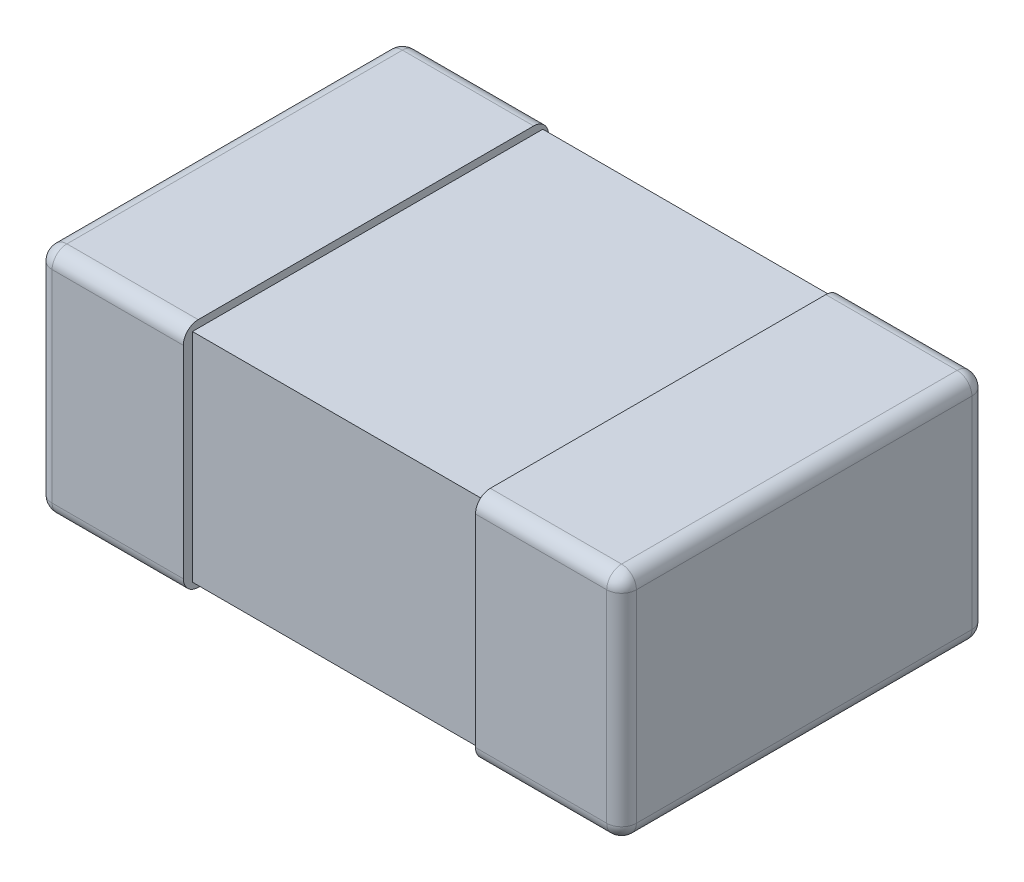
ISO-10303-21;
HEADER;
FILE_DESCRIPTION(('STEP AP214'),'2;1');
FILE_NAME('part.step','',(''),(''),'','','');
FILE_SCHEMA(('AUTOMOTIVE_DESIGN { 1 0 10303 214 1 1 1 1 }'));
ENDSEC;
DATA;
#1=APPLICATION_CONTEXT('core data for automotive mechanical design processes');
#2=APPLICATION_PROTOCOL_DEFINITION('international standard','automotive_design',2000,#1);
#3=PRODUCT_CONTEXT('',#1,'mechanical');
#4=PRODUCT('Part','Part','',(#3));
#5=PRODUCT_RELATED_PRODUCT_CATEGORY('part','',(#4));
#6=PRODUCT_DEFINITION_FORMATION('','',#4);
#7=PRODUCT_DEFINITION_CONTEXT('part definition',#1,'design');
#8=PRODUCT_DEFINITION('design','',#6,#7);
#9=PRODUCT_DEFINITION_SHAPE('','',#8);
#10=(LENGTH_UNIT() NAMED_UNIT(*) SI_UNIT(.MILLI.,.METRE.));
#11=(NAMED_UNIT(*) PLANE_ANGLE_UNIT() SI_UNIT($,.RADIAN.));
#12=(NAMED_UNIT(*) SI_UNIT($,.STERADIAN.) SOLID_ANGLE_UNIT());
#13=UNCERTAINTY_MEASURE_WITH_UNIT(LENGTH_MEASURE(1.E-05),#10,'distance_accuracy_value','');
#14=(GEOMETRIC_REPRESENTATION_CONTEXT(3) GLOBAL_UNCERTAINTY_ASSIGNED_CONTEXT((#13)) GLOBAL_UNIT_ASSIGNED_CONTEXT((#10,
#11,#12)) REPRESENTATION_CONTEXT('',''));
#15=CARTESIAN_POINT('',(0.,0.,0.));
#16=DIRECTION('',(0.,0.,1.));
#17=DIRECTION('',(1.,0.,0.));
#18=AXIS2_PLACEMENT_3D('',#15,#16,#17);
#19=CARTESIAN_POINT('',(-0.875,0.74295,-1.1992));
#20=DIRECTION('',(-1.,0.,0.));
#21=DIRECTION('',(0.,0.707106781186548,-0.707106781186548));
#22=AXIS2_PLACEMENT_3D('',#19,#20,#21);
#23=CYLINDRICAL_SURFACE('',#22,0.0508);
#24=CARTESIAN_POINT('',(-1.5,0.74295,-1.1992));
#25=DIRECTION('',(-1.,0.,0.));
#26=DIRECTION('',(0.,0.707106781186548,-0.707106781186548));
#27=AXIS2_PLACEMENT_3D('',#24,#25,#26);
#28=CIRCLE('',#27,0.0508);
#29=CARTESIAN_POINT('',(-1.5,0.79375,-1.1992));
#30=VERTEX_POINT('',#29);
#31=CARTESIAN_POINT('',(-1.5,0.74295,-1.25));
#32=VERTEX_POINT('',#31);
#33=EDGE_CURVE('E366',#30,#32,#28,.T.);
#34=ORIENTED_EDGE('',*,*,#33,.T.);
#35=DIRECTION('',(-1.,0.,0.));
#36=VECTOR('',#35,1.);
#37=CARTESIAN_POINT('',(-0.875,0.74295,-1.25));
#38=LINE('',#37,#36);
#39=CARTESIAN_POINT('',(-1.9492,0.74295,-1.25));
#40=VERTEX_POINT('',#39);
#41=EDGE_CURVE('E20',#32,#40,#38,.T.);
#42=ORIENTED_EDGE('',*,*,#41,.T.);
#43=CARTESIAN_POINT('',(-1.9492,0.74295,-1.1992));
#44=DIRECTION('',(1.,0.,0.));
#45=DIRECTION('',(0.,0.,-1.));
#46=AXIS2_PLACEMENT_3D('',#43,#44,#45);
#47=CIRCLE('',#46,0.0508);
#48=CARTESIAN_POINT('',(-1.9492,0.79375,-1.1992));
#49=VERTEX_POINT('',#48);
#50=EDGE_CURVE('E269',#40,#49,#47,.T.);
#51=ORIENTED_EDGE('',*,*,#50,.T.);
#52=DIRECTION('',(1.,0.,0.));
#53=VECTOR('',#52,1.);
#54=CARTESIAN_POINT('',(-0.875,0.79375,-1.1992));
#55=LINE('',#54,#53);
#56=EDGE_CURVE('E275',#49,#30,#55,.T.);
#57=ORIENTED_EDGE('',*,*,#56,.T.);
#58=EDGE_LOOP('',(#34,#42,#51,#57));
#59=FACE_BOUND('',#58,.T.);
#60=ADVANCED_FACE('F16',(#59),#23,.T.);
#61=CARTESIAN_POINT('',(-1.9492,0.,-1.1992));
#62=DIRECTION('',(0.,1.,0.));
#63=DIRECTION('',(-0.707106781186549,0.,-0.707106781186546));
#64=AXIS2_PLACEMENT_3D('',#61,#62,#63);
#65=CYLINDRICAL_SURFACE('',#64,0.0508);
#66=CARTESIAN_POINT('',(-1.9492,0.0508,-1.1992));
#67=DIRECTION('',(0.,1.,0.));
#68=DIRECTION('',(0.,0.,-1.));
#69=AXIS2_PLACEMENT_3D('',#66,#67,#68);
#70=CIRCLE('',#69,0.0508);
#71=CARTESIAN_POINT('',(-1.9492,0.0508,-1.25));
#72=VERTEX_POINT('',#71);
#73=CARTESIAN_POINT('',(-2.,0.0508,-1.1992));
#74=VERTEX_POINT('',#73);
#75=EDGE_CURVE('E11',#72,#74,#70,.T.);
#76=ORIENTED_EDGE('',*,*,#75,.T.);
#77=DIRECTION('',(0.,1.,0.));
#78=VECTOR('',#77,1.);
#79=CARTESIAN_POINT('',(-2.,0.,-1.1992));
#80=LINE('',#79,#78);
#81=CARTESIAN_POINT('',(-2.,0.74295,-1.1992));
#82=VERTEX_POINT('',#81);
#83=EDGE_CURVE('E384',#74,#82,#80,.T.);
#84=ORIENTED_EDGE('',*,*,#83,.T.);
#85=CARTESIAN_POINT('',(-1.9492,0.74295,-1.1992));
#86=DIRECTION('',(0.,-1.,0.));
#87=DIRECTION('',(-1.,0.,0.));
#88=AXIS2_PLACEMENT_3D('',#85,#86,#87);
#89=CIRCLE('',#88,0.0508);
#90=EDGE_CURVE('E41',#82,#40,#89,.T.);
#91=ORIENTED_EDGE('',*,*,#90,.T.);
#92=DIRECTION('',(0.,-1.,0.));
#93=VECTOR('',#92,1.);
#94=CARTESIAN_POINT('',(-1.9492,0.,-1.25));
#95=LINE('',#94,#93);
#96=EDGE_CURVE('E280',#40,#72,#95,.T.);
#97=ORIENTED_EDGE('',*,*,#96,.T.);
#98=EDGE_LOOP('',(#76,#84,#91,#97));
#99=FACE_BOUND('',#98,.T.);
#100=ADVANCED_FACE('F623',(#99),#65,.T.);
#101=CARTESIAN_POINT('',(-0.875,0.0508,-1.1992));
#102=DIRECTION('',(-1.,0.,0.));
#103=DIRECTION('',(0.,-0.707106781186547,-0.707106781186548));
#104=AXIS2_PLACEMENT_3D('',#101,#102,#103);
#105=CYLINDRICAL_SURFACE('',#104,0.0508);
#106=CARTESIAN_POINT('',(-1.5,0.0508,-1.1992));
#107=DIRECTION('',(-1.,0.,0.));
#108=DIRECTION('',(0.,-0.707106781186547,-0.707106781186548));
#109=AXIS2_PLACEMENT_3D('',#106,#107,#108);
#110=CIRCLE('',#109,0.0508);
#111=CARTESIAN_POINT('',(-1.5,0.0508,-1.25));
#112=VERTEX_POINT('',#111);
#113=CARTESIAN_POINT('',(-1.5,0.,-1.1992));
#114=VERTEX_POINT('',#113);
#115=EDGE_CURVE('E293',#112,#114,#110,.T.);
#116=ORIENTED_EDGE('',*,*,#115,.T.);
#117=DIRECTION('',(-1.,0.,0.));
#118=VECTOR('',#117,1.);
#119=CARTESIAN_POINT('',(-0.875,0.,-1.1992));
#120=LINE('',#119,#118);
#121=CARTESIAN_POINT('',(-1.9492,0.,-1.1992));
#122=VERTEX_POINT('',#121);
#123=EDGE_CURVE('E106',#114,#122,#120,.T.);
#124=ORIENTED_EDGE('',*,*,#123,.T.);
#125=CARTESIAN_POINT('',(-1.9492,0.0508,-1.1992));
#126=DIRECTION('',(1.,0.,0.));
#127=DIRECTION('',(0.,-1.,0.));
#128=AXIS2_PLACEMENT_3D('',#125,#126,#127);
#129=CIRCLE('',#128,0.0508);
#130=EDGE_CURVE('E27',#122,#72,#129,.T.);
#131=ORIENTED_EDGE('',*,*,#130,.T.);
#132=DIRECTION('',(1.,0.,0.));
#133=VECTOR('',#132,1.);
#134=CARTESIAN_POINT('',(-0.875,0.0508,-1.25));
#135=LINE('',#134,#133);
#136=EDGE_CURVE('E285',#72,#112,#135,.T.);
#137=ORIENTED_EDGE('',*,*,#136,.T.);
#138=EDGE_LOOP('',(#116,#124,#131,#137));
#139=FACE_BOUND('',#138,.T.);
#140=ADVANCED_FACE('F628',(#139),#105,.T.);
#141=CARTESIAN_POINT('',(-1.9492,0.0508,-1.1992));
#142=DIRECTION('',(0.408248290463862,-0.816496580927727,0.408248290463862));
#143=DIRECTION('',(-0.577350269189626,-0.577350269189624,-0.577350269189626));
#144=AXIS2_PLACEMENT_3D('',#141,#142,#143);
#145=SPHERICAL_SURFACE('',#144,0.0508);
#146=ORIENTED_EDGE('',*,*,#130,.F.);
#147=CARTESIAN_POINT('',(-1.9492,0.0508,-1.1992));
#148=DIRECTION('',(0.,0.,-1.));
#149=DIRECTION('',(-0.707106781186549,-0.707106781186546,0.));
#150=AXIS2_PLACEMENT_3D('',#147,#148,#149);
#151=CIRCLE('',#150,0.0508);
#152=EDGE_CURVE('E317',#122,#74,#151,.T.);
#153=ORIENTED_EDGE('',*,*,#152,.T.);
#154=ORIENTED_EDGE('',*,*,#75,.F.);
#155=EDGE_LOOP('',(#146,#153,#154));
#156=FACE_BOUND('',#155,.T.);
#157=ADVANCED_FACE('F717',(#156),#145,.T.);
#158=CARTESIAN_POINT('',(-1.9492,0.74295,-1.1992));
#159=DIRECTION('',(-0.408248290463861,-0.816496580927726,-0.408248290463865));
#160=DIRECTION('',(-0.577350269189626,0.577350269189626,-0.577350269189626));
#161=AXIS2_PLACEMENT_3D('',#158,#159,#160);
#162=SPHERICAL_SURFACE('',#161,0.0508);
#163=ORIENTED_EDGE('',*,*,#90,.F.);
#164=CARTESIAN_POINT('',(-1.9492,0.74295,-1.1992));
#165=DIRECTION('',(0.,0.,-1.));
#166=DIRECTION('',(-0.707106781186549,0.707106781186546,0.));
#167=AXIS2_PLACEMENT_3D('',#164,#165,#166);
#168=CIRCLE('',#167,0.0508);
#169=EDGE_CURVE('E355',#82,#49,#168,.T.);
#170=ORIENTED_EDGE('',*,*,#169,.T.);
#171=ORIENTED_EDGE('',*,*,#50,.F.);
#172=EDGE_LOOP('',(#163,#170,#171));
#173=FACE_BOUND('',#172,.T.);
#174=ADVANCED_FACE('F687',(#173),#162,.T.);
#175=CARTESIAN_POINT('',(-1.9492,0.74295,-0.9375));
#176=DIRECTION('',(0.,0.,1.));
#177=DIRECTION('',(-0.707106781186549,0.707106781186546,0.));
#178=AXIS2_PLACEMENT_3D('',#175,#176,#177);
#179=CYLINDRICAL_SURFACE('',#178,0.0508);
#180=ORIENTED_EDGE('',*,*,#169,.F.);
#181=DIRECTION('',(0.,0.,1.));
#182=VECTOR('',#181,1.);
#183=CARTESIAN_POINT('',(-2.,0.74295,-0.9375));
#184=LINE('',#183,#182);
#185=CARTESIAN_POINT('',(-2.,0.74295,-0.0508));
#186=VERTEX_POINT('',#185);
#187=EDGE_CURVE('E388',#82,#186,#184,.T.);
#188=ORIENTED_EDGE('',*,*,#187,.T.);
#189=CARTESIAN_POINT('',(-1.9492,0.74295,-0.0508));
#190=DIRECTION('',(0.,0.,-1.));
#191=DIRECTION('',(-1.,0.,0.));
#192=AXIS2_PLACEMENT_3D('',#189,#190,#191);
#193=CIRCLE('',#192,0.0508);
#194=CARTESIAN_POINT('',(-1.9492,0.79375,-0.0508));
#195=VERTEX_POINT('',#194);
#196=EDGE_CURVE('E363',#186,#195,#193,.T.);
#197=ORIENTED_EDGE('',*,*,#196,.T.);
#198=DIRECTION('',(0.,0.,-1.));
#199=VECTOR('',#198,1.);
#200=CARTESIAN_POINT('',(-1.9492,0.79375,-0.9375));
#201=LINE('',#200,#199);
#202=EDGE_CURVE('E279',#195,#49,#201,.T.);
#203=ORIENTED_EDGE('',*,*,#202,.T.);
#204=EDGE_LOOP('',(#180,#188,#197,#203));
#205=FACE_BOUND('',#204,.T.);
#206=ADVANCED_FACE('F685',(#205),#179,.T.);
#207=CARTESIAN_POINT('',(-2.,0.,-1.25));
#208=DIRECTION('',(-1.,0.,0.));
#209=DIRECTION('',(0.,0.,1.));
#210=AXIS2_PLACEMENT_3D('',#207,#208,#209);
#211=PLANE('',#210);
#212=ORIENTED_EDGE('',*,*,#83,.F.);
#213=DIRECTION('',(0.,0.,-1.));
#214=VECTOR('',#213,1.);
#215=CARTESIAN_POINT('',(-2.,0.0508,-0.9375));
#216=LINE('',#215,#214);
#217=CARTESIAN_POINT('',(-2.,0.0508,-0.0508));
#218=VERTEX_POINT('',#217);
#219=EDGE_CURVE('E389',#218,#74,#216,.T.);
#220=ORIENTED_EDGE('',*,*,#219,.F.);
#221=DIRECTION('',(0.,-1.,0.));
#222=VECTOR('',#221,1.);
#223=CARTESIAN_POINT('',(-2.,0.,-0.0508));
#224=LINE('',#223,#222);
#225=EDGE_CURVE('E318',#186,#218,#224,.T.);
#226=ORIENTED_EDGE('',*,*,#225,.F.);
#227=ORIENTED_EDGE('',*,*,#187,.F.);
#228=EDGE_LOOP('',(#212,#220,#226,#227));
#229=FACE_BOUND('',#228,.T.);
#230=ADVANCED_FACE('F665',(#229),#211,.T.);
#231=CARTESIAN_POINT('',(-1.9492,0.0508,-0.9375));
#232=DIRECTION('',(0.,0.,1.));
#233=DIRECTION('',(-0.70710678118655,-0.707106781186546,0.));
#234=AXIS2_PLACEMENT_3D('',#231,#232,#233);
#235=CYLINDRICAL_SURFACE('',#234,0.0508);
#236=ORIENTED_EDGE('',*,*,#152,.F.);
#237=DIRECTION('',(0.,0.,1.));
#238=VECTOR('',#237,1.);
#239=CARTESIAN_POINT('',(-1.9492,0.,-0.9375));
#240=LINE('',#239,#238);
#241=CARTESIAN_POINT('',(-1.9492,0.,-0.0508));
#242=VERTEX_POINT('',#241);
#243=EDGE_CURVE('E314',#122,#242,#240,.T.);
#244=ORIENTED_EDGE('',*,*,#243,.T.);
#245=CARTESIAN_POINT('',(-1.9492,0.0508,-0.0508));
#246=DIRECTION('',(0.,0.,-1.));
#247=DIRECTION('',(0.,-1.,0.));
#248=AXIS2_PLACEMENT_3D('',#245,#246,#247);
#249=CIRCLE('',#248,0.0508);
#250=EDGE_CURVE('E338',#242,#218,#249,.T.);
#251=ORIENTED_EDGE('',*,*,#250,.T.);
#252=ORIENTED_EDGE('',*,*,#219,.T.);
#253=EDGE_LOOP('',(#236,#244,#251,#252));
#254=FACE_BOUND('',#253,.T.);
#255=ADVANCED_FACE('F661',(#254),#235,.T.);
#256=CARTESIAN_POINT('',(-0.25,0.,-0.625));
#257=DIRECTION('',(0.,1.,0.));
#258=DIRECTION('',(1.,0.,0.));
#259=AXIS2_PLACEMENT_3D('',#256,#257,#258);
#260=PLANE('',#259);
#261=ORIENTED_EDGE('',*,*,#123,.F.);
#262=DIRECTION('',(0.,0.,-1.));
#263=VECTOR('',#262,1.);
#264=CARTESIAN_POINT('',(-1.5,0.,0.));
#265=LINE('',#264,#263);
#266=CARTESIAN_POINT('',(-1.5,0.,-0.0508));
#267=VERTEX_POINT('',#266);
#268=EDGE_CURVE('E289',#267,#114,#265,.T.);
#269=ORIENTED_EDGE('',*,*,#268,.F.);
#270=DIRECTION('',(1.,0.,0.));
#271=VECTOR('',#270,1.);
#272=CARTESIAN_POINT('',(-1.125,0.,-0.0508));
#273=LINE('',#272,#271);
#274=EDGE_CURVE('E409',#242,#267,#273,.T.);
#275=ORIENTED_EDGE('',*,*,#274,.F.);
#276=ORIENTED_EDGE('',*,*,#243,.F.);
#277=EDGE_LOOP('',(#261,#269,#275,#276));
#278=FACE_BOUND('',#277,.T.);
#279=ADVANCED_FACE('F664',(#278),#260,.F.);
#280=CARTESIAN_POINT('',(-1.125,0.0508,-0.0508));
#281=DIRECTION('',(1.,0.,0.));
#282=DIRECTION('',(0.,-0.707106781186548,0.707106781186547));
#283=AXIS2_PLACEMENT_3D('',#280,#281,#282);
#284=CYLINDRICAL_SURFACE('',#283,0.0508);
#285=CARTESIAN_POINT('',(-1.5,0.0508,-0.0508));
#286=DIRECTION('',(-1.,0.,0.));
#287=DIRECTION('',(0.,-0.707106781186548,0.707106781186547));
#288=AXIS2_PLACEMENT_3D('',#285,#286,#287);
#289=CIRCLE('',#288,0.0508);
#290=CARTESIAN_POINT('',(-1.5,0.0508,0.));
#291=VERTEX_POINT('',#290);
#292=EDGE_CURVE('E294',#267,#291,#289,.T.);
#293=ORIENTED_EDGE('',*,*,#292,.T.);
#294=DIRECTION('',(-1.,0.,0.));
#295=VECTOR('',#294,1.);
#296=CARTESIAN_POINT('',(-1.125,0.0508,0.));
#297=LINE('',#296,#295);
#298=CARTESIAN_POINT('',(-1.9492,0.0508,0.));
#299=VERTEX_POINT('',#298);
#300=EDGE_CURVE('E192',#291,#299,#297,.T.);
#301=ORIENTED_EDGE('',*,*,#300,.T.);
#302=CARTESIAN_POINT('',(-1.9492,0.0508,-0.0508));
#303=DIRECTION('',(1.,0.,0.));
#304=DIRECTION('',(0.,0.,1.));
#305=AXIS2_PLACEMENT_3D('',#302,#303,#304);
#306=CIRCLE('',#305,0.0508);
#307=EDGE_CURVE('E91',#299,#242,#306,.T.);
#308=ORIENTED_EDGE('',*,*,#307,.T.);
#309=ORIENTED_EDGE('',*,*,#274,.T.);
#310=EDGE_LOOP('',(#293,#301,#308,#309));
#311=FACE_BOUND('',#310,.T.);
#312=ADVANCED_FACE('F673',(#311),#284,.T.);
#313=CARTESIAN_POINT('',(-1.9492,0.0508,-0.0508));
#314=DIRECTION('',(0.408248290463861,-0.816496580927725,-0.408248290463867));
#315=DIRECTION('',(-0.57735026918962,-0.577350269189628,0.57735026918963));
#316=AXIS2_PLACEMENT_3D('',#313,#314,#315);
#317=SPHERICAL_SURFACE('',#316,0.0508);
#318=ORIENTED_EDGE('',*,*,#307,.F.);
#319=CARTESIAN_POINT('',(-1.9492,0.0508,-0.0508));
#320=DIRECTION('',(0.,-1.,0.));
#321=DIRECTION('',(-0.707106781186545,0.,0.707106781186551));
#322=AXIS2_PLACEMENT_3D('',#319,#320,#321);
#323=CIRCLE('',#322,0.0508);
#324=EDGE_CURVE('E322',#299,#218,#323,.T.);
#325=ORIENTED_EDGE('',*,*,#324,.T.);
#326=ORIENTED_EDGE('',*,*,#250,.F.);
#327=EDGE_LOOP('',(#318,#325,#326));
#328=FACE_BOUND('',#327,.T.);
#329=ADVANCED_FACE('F18',(#328),#317,.T.);
#330=CARTESIAN_POINT('',(-1.9492,0.,-0.0508));
#331=DIRECTION('',(0.,1.,0.));
#332=DIRECTION('',(-0.707106781186546,0.,0.707106781186549));
#333=AXIS2_PLACEMENT_3D('',#330,#331,#332);
#334=CYLINDRICAL_SURFACE('',#333,0.0508);
#335=ORIENTED_EDGE('',*,*,#324,.F.);
#336=DIRECTION('',(0.,1.,0.));
#337=VECTOR('',#336,1.);
#338=CARTESIAN_POINT('',(-1.9492,0.,0.));
#339=LINE('',#338,#337);
#340=CARTESIAN_POINT('',(-1.9492,0.74295,0.));
#341=VERTEX_POINT('',#340);
#342=EDGE_CURVE('E333',#299,#341,#339,.T.);
#343=ORIENTED_EDGE('',*,*,#342,.T.);
#344=CARTESIAN_POINT('',(-1.9492,0.74295,-0.0508));
#345=DIRECTION('',(0.,1.,0.));
#346=DIRECTION('',(-0.707106781186545,0.,0.707106781186551));
#347=AXIS2_PLACEMENT_3D('',#344,#345,#346);
#348=CIRCLE('',#347,0.0508);
#349=EDGE_CURVE('E358',#186,#341,#348,.T.);
#350=ORIENTED_EDGE('',*,*,#349,.F.);
#351=ORIENTED_EDGE('',*,*,#225,.T.);
#352=EDGE_LOOP('',(#335,#343,#350,#351));
#353=FACE_BOUND('',#352,.T.);
#354=ADVANCED_FACE('F657',(#353),#334,.T.);
#355=CARTESIAN_POINT('',(-2.,0.,0.));
#356=DIRECTION('',(0.,0.,1.));
#357=DIRECTION('',(1.,0.,0.));
#358=AXIS2_PLACEMENT_3D('',#355,#356,#357);
#359=PLANE('',#358);
#360=ORIENTED_EDGE('',*,*,#300,.F.);
#361=DIRECTION('',(0.,1.,0.));
#362=VECTOR('',#361,1.);
#363=CARTESIAN_POINT('',(-1.5,0.,0.));
#364=LINE('',#363,#362);
#365=CARTESIAN_POINT('',(-1.5,0.74295,0.));
#366=VERTEX_POINT('',#365);
#367=EDGE_CURVE('E183',#291,#366,#364,.T.);
#368=ORIENTED_EDGE('',*,*,#367,.T.);
#369=DIRECTION('',(1.,0.,0.));
#370=VECTOR('',#369,1.);
#371=CARTESIAN_POINT('',(-1.125,0.74295,0.));
#372=LINE('',#371,#370);
#373=EDGE_CURVE('E453',#341,#366,#372,.T.);
#374=ORIENTED_EDGE('',*,*,#373,.F.);
#375=ORIENTED_EDGE('',*,*,#342,.F.);
#376=EDGE_LOOP('',(#360,#368,#374,#375));
#377=FACE_BOUND('',#376,.T.);
#378=ADVANCED_FACE('F655',(#377),#359,.T.);
#379=CARTESIAN_POINT('',(-1.5,0.,0.));
#380=DIRECTION('',(1.,0.,0.));
#381=DIRECTION('',(0.,1.,0.));
#382=AXIS2_PLACEMENT_3D('',#379,#380,#381);
#383=PLANE('',#382);
#384=ORIENTED_EDGE('',*,*,#33,.F.);
#385=DIRECTION('',(0.,0.,-1.));
#386=VECTOR('',#385,1.);
#387=CARTESIAN_POINT('',(-1.5,0.79375,0.));
#388=LINE('',#387,#386);
#389=CARTESIAN_POINT('',(-1.5,0.79375,-0.0508));
#390=VERTEX_POINT('',#389);
#391=EDGE_CURVE('E371',#390,#30,#388,.T.);
#392=ORIENTED_EDGE('',*,*,#391,.F.);
#393=CARTESIAN_POINT('',(-1.5,0.74295,-0.0508));
#394=DIRECTION('',(-1.,0.,0.));
#395=DIRECTION('',(0.,0.707106781186548,0.707106781186548));
#396=AXIS2_PLACEMENT_3D('',#393,#394,#395);
#397=CIRCLE('',#396,0.0508);
#398=EDGE_CURVE('E436',#366,#390,#397,.T.);
#399=ORIENTED_EDGE('',*,*,#398,.F.);
#400=ORIENTED_EDGE('',*,*,#367,.F.);
#401=ORIENTED_EDGE('',*,*,#292,.F.);
#402=ORIENTED_EDGE('',*,*,#268,.T.);
#403=ORIENTED_EDGE('',*,*,#115,.F.);
#404=DIRECTION('',(0.,1.,0.));
#405=VECTOR('',#404,1.);
#406=CARTESIAN_POINT('',(-1.5,0.,-1.25));
#407=LINE('',#406,#405);
#408=EDGE_CURVE('E327',#112,#32,#407,.T.);
#409=ORIENTED_EDGE('',*,*,#408,.T.);
#410=EDGE_LOOP('',(#384,#392,#399,#400,#401,#402,#403,#409));
#411=FACE_BOUND('',#410,.T.);
#412=DIRECTION('',(0.,0.,1.));
#413=VECTOR('',#412,1.);
#414=CARTESIAN_POINT('',(-1.5,0.0254,-0.0311176478090803));
#415=LINE('',#414,#413);
#416=CARTESIAN_POINT('',(-1.5,0.0254,-1.2303875922363));
#417=VERTEX_POINT('',#416);
#418=CARTESIAN_POINT('',(-1.5,0.0254,-0.0311176478090803));
#419=VERTEX_POINT('',#418);
#420=EDGE_CURVE('E310',#417,#419,#415,.T.);
#421=ORIENTED_EDGE('',*,*,#420,.T.);
#422=DIRECTION('',(0.,1.,0.));
#423=VECTOR('',#422,1.);
#424=CARTESIAN_POINT('',(-1.5,0.,-0.0311176478090803));
#425=LINE('',#424,#423);
#426=CARTESIAN_POINT('',(-1.5,0.76835,-0.0311176478090803));
#427=VERTEX_POINT('',#426);
#428=EDGE_CURVE('E257',#419,#427,#425,.T.);
#429=ORIENTED_EDGE('',*,*,#428,.T.);
#430=DIRECTION('',(0.,0.,-1.));
#431=VECTOR('',#430,1.);
#432=CARTESIAN_POINT('',(-1.5,0.76835,-1.2303875922363));
#433=LINE('',#432,#431);
#434=CARTESIAN_POINT('',(-1.5,0.76835,-1.2303875922363));
#435=VERTEX_POINT('',#434);
#436=EDGE_CURVE('E442',#427,#435,#433,.T.);
#437=ORIENTED_EDGE('',*,*,#436,.T.);
#438=DIRECTION('',(0.,-1.,0.));
#439=VECTOR('',#438,1.);
#440=CARTESIAN_POINT('',(-1.5,0.,-1.2303875922363));
#441=LINE('',#440,#439);
#442=EDGE_CURVE('E264',#435,#417,#441,.T.);
#443=ORIENTED_EDGE('',*,*,#442,.T.);
#444=EDGE_LOOP('',(#421,#429,#437,#443));
#445=FACE_BOUND('',#444,.T.);
#446=ADVANCED_FACE('F651',(#411,#445),#383,.T.);
#447=CARTESIAN_POINT('',(-1.125,0.74295,-0.0508));
#448=DIRECTION('',(1.,0.,0.));
#449=DIRECTION('',(0.,0.707106781186548,0.707106781186548));
#450=AXIS2_PLACEMENT_3D('',#447,#448,#449);
#451=CYLINDRICAL_SURFACE('',#450,0.0508);
#452=ORIENTED_EDGE('',*,*,#398,.T.);
#453=DIRECTION('',(-1.,0.,0.));
#454=VECTOR('',#453,1.);
#455=CARTESIAN_POINT('',(-1.125,0.79375,-0.0508));
#456=LINE('',#455,#454);
#457=EDGE_CURVE('E367',#390,#195,#456,.T.);
#458=ORIENTED_EDGE('',*,*,#457,.T.);
#459=CARTESIAN_POINT('',(-1.9492,0.74295,-0.0508));
#460=DIRECTION('',(1.,0.,0.));
#461=DIRECTION('',(0.,1.,0.));
#462=AXIS2_PLACEMENT_3D('',#459,#460,#461);
#463=CIRCLE('',#462,0.0508);
#464=EDGE_CURVE('E362',#195,#341,#463,.T.);
#465=ORIENTED_EDGE('',*,*,#464,.T.);
#466=ORIENTED_EDGE('',*,*,#373,.T.);
#467=EDGE_LOOP('',(#452,#458,#465,#466));
#468=FACE_BOUND('',#467,.T.);
#469=ADVANCED_FACE('F654',(#468),#451,.T.);
#470=CARTESIAN_POINT('',(-1.9492,0.74295,-0.0508));
#471=DIRECTION('',(-0.408248290463861,-0.816496580927726,0.408248290463865));
#472=DIRECTION('',(-0.577350269189626,0.577350269189626,0.577350269189626));
#473=AXIS2_PLACEMENT_3D('',#470,#471,#472);
#474=SPHERICAL_SURFACE('',#473,0.0508);
#475=ORIENTED_EDGE('',*,*,#196,.F.);
#476=ORIENTED_EDGE('',*,*,#349,.T.);
#477=ORIENTED_EDGE('',*,*,#464,.F.);
#478=EDGE_LOOP('',(#475,#476,#477));
#479=FACE_BOUND('',#478,.T.);
#480=ADVANCED_FACE('F689',(#479),#474,.T.);
#481=CARTESIAN_POINT('',(-0.25,0.79375,-0.625));
#482=DIRECTION('',(0.,1.,0.));
#483=DIRECTION('',(1.,0.,0.));
#484=AXIS2_PLACEMENT_3D('',#481,#482,#483);
#485=PLANE('',#484);
#486=ORIENTED_EDGE('',*,*,#56,.F.);
#487=ORIENTED_EDGE('',*,*,#202,.F.);
#488=ORIENTED_EDGE('',*,*,#457,.F.);
#489=ORIENTED_EDGE('',*,*,#391,.T.);
#490=EDGE_LOOP('',(#486,#487,#488,#489));
#491=FACE_BOUND('',#490,.T.);
#492=ADVANCED_FACE('F691',(#491),#485,.T.);
#493=CARTESIAN_POINT('',(-0.875,0.0508,-1.1992));
#494=DIRECTION('',(-1.,0.,0.));
#495=DIRECTION('',(0.,-0.707106781186547,-0.707106781186548));
#496=AXIS2_PLACEMENT_3D('',#493,#494,#495);
#497=CYLINDRICAL_SURFACE('',#496,0.0508);
#498=CARTESIAN_POINT('',(-0.5,0.0508,-1.1992));
#499=DIRECTION('',(1.,0.,0.));
#500=DIRECTION('',(0.,0.,1.));
#501=AXIS2_PLACEMENT_3D('',#498,#499,#500);
#502=CIRCLE('',#501,0.0508);
#503=CARTESIAN_POINT('',(-0.5,0.,-1.1992));
#504=VERTEX_POINT('',#503);
#505=CARTESIAN_POINT('',(-0.5,0.0508,-1.25));
#506=VERTEX_POINT('',#505);
#507=EDGE_CURVE('E218',#504,#506,#502,.T.);
#508=ORIENTED_EDGE('',*,*,#507,.T.);
#509=DIRECTION('',(1.,0.,0.));
#510=VECTOR('',#509,1.);
#511=CARTESIAN_POINT('',(-0.875,0.0508,-1.25));
#512=LINE('',#511,#510);
#513=CARTESIAN_POINT('',(-0.0508,0.0508,-1.25));
#514=VERTEX_POINT('',#513);
#515=EDGE_CURVE('E222',#506,#514,#512,.T.);
#516=ORIENTED_EDGE('',*,*,#515,.T.);
#517=CARTESIAN_POINT('',(-0.0508,0.0508,-1.1992));
#518=DIRECTION('',(-1.,0.,0.));
#519=DIRECTION('',(0.,0.,1.));
#520=AXIS2_PLACEMENT_3D('',#517,#518,#519);
#521=CIRCLE('',#520,0.0508);
#522=CARTESIAN_POINT('',(-0.0508,0.,-1.1992));
#523=VERTEX_POINT('',#522);
#524=EDGE_CURVE('E382',#514,#523,#521,.T.);
#525=ORIENTED_EDGE('',*,*,#524,.T.);
#526=DIRECTION('',(-1.,0.,0.));
#527=VECTOR('',#526,1.);
#528=CARTESIAN_POINT('',(-0.875,0.,-1.1992));
#529=LINE('',#528,#527);
#530=EDGE_CURVE('E224',#523,#504,#529,.T.);
#531=ORIENTED_EDGE('',*,*,#530,.T.);
#532=EDGE_LOOP('',(#508,#516,#525,#531));
#533=FACE_BOUND('',#532,.T.);
#534=ADVANCED_FACE('F220',(#533),#497,.T.);
#535=CARTESIAN_POINT('',(-0.0508,0.,-1.1992));
#536=DIRECTION('',(0.,1.,0.));
#537=DIRECTION('',(0.707106781186547,0.,-0.707106781186548));
#538=AXIS2_PLACEMENT_3D('',#535,#536,#537);
#539=CYLINDRICAL_SURFACE('',#538,0.0508);
#540=CARTESIAN_POINT('',(-0.0508,0.0508,-1.1992));
#541=DIRECTION('',(0.,1.,0.));
#542=DIRECTION('',(1.,0.,0.));
#543=AXIS2_PLACEMENT_3D('',#540,#541,#542);
#544=CIRCLE('',#543,0.0508);
#545=CARTESIAN_POINT('',(0.,0.0508,-1.1992));
#546=VERTEX_POINT('',#545);
#547=EDGE_CURVE('E148',#546,#514,#544,.T.);
#548=ORIENTED_EDGE('',*,*,#547,.T.);
#549=DIRECTION('',(0.,1.,0.));
#550=VECTOR('',#549,1.);
#551=CARTESIAN_POINT('',(-0.0508,0.,-1.25));
#552=LINE('',#551,#550);
#553=CARTESIAN_POINT('',(-0.0508,0.74295,-1.25));
#554=VERTEX_POINT('',#553);
#555=EDGE_CURVE('E248',#514,#554,#552,.T.);
#556=ORIENTED_EDGE('',*,*,#555,.T.);
#557=CARTESIAN_POINT('',(-0.0508,0.74295,-1.1992));
#558=DIRECTION('',(0.,-1.,0.));
#559=DIRECTION('',(0.,0.,-1.));
#560=AXIS2_PLACEMENT_3D('',#557,#558,#559);
#561=CIRCLE('',#560,0.0508);
#562=CARTESIAN_POINT('',(0.,0.74295,-1.1992));
#563=VERTEX_POINT('',#562);
#564=EDGE_CURVE('E136',#554,#563,#561,.T.);
#565=ORIENTED_EDGE('',*,*,#564,.T.);
#566=DIRECTION('',(0.,-1.,0.));
#567=VECTOR('',#566,1.);
#568=CARTESIAN_POINT('',(0.,0.,-1.1992));
#569=LINE('',#568,#567);
#570=EDGE_CURVE('E305',#563,#546,#569,.T.);
#571=ORIENTED_EDGE('',*,*,#570,.T.);
#572=EDGE_LOOP('',(#548,#556,#565,#571));
#573=FACE_BOUND('',#572,.T.);
#574=ADVANCED_FACE('F671',(#573),#539,.T.);
#575=CARTESIAN_POINT('',(-0.875,0.74295,-1.1992));
#576=DIRECTION('',(-1.,0.,0.));
#577=DIRECTION('',(0.,0.707106781186548,-0.707106781186548));
#578=AXIS2_PLACEMENT_3D('',#575,#576,#577);
#579=CYLINDRICAL_SURFACE('',#578,0.0508);
#580=CARTESIAN_POINT('',(-0.5,0.74295,-1.1992));
#581=DIRECTION('',(1.,0.,0.));
#582=DIRECTION('',(0.,0.,1.));
#583=AXIS2_PLACEMENT_3D('',#580,#581,#582);
#584=CIRCLE('',#583,0.0508);
#585=CARTESIAN_POINT('',(-0.5,0.74295,-1.25));
#586=VERTEX_POINT('',#585);
#587=CARTESIAN_POINT('',(-0.5,0.79375,-1.1992));
#588=VERTEX_POINT('',#587);
#589=EDGE_CURVE('E239',#586,#588,#584,.T.);
#590=ORIENTED_EDGE('',*,*,#589,.T.);
#591=DIRECTION('',(1.,0.,0.));
#592=VECTOR('',#591,1.);
#593=CARTESIAN_POINT('',(-0.875,0.79375,-1.1992));
#594=LINE('',#593,#592);
#595=CARTESIAN_POINT('',(-0.0508,0.79375,-1.1992));
#596=VERTEX_POINT('',#595);
#597=EDGE_CURVE('E419',#588,#596,#594,.T.);
#598=ORIENTED_EDGE('',*,*,#597,.T.);
#599=CARTESIAN_POINT('',(-0.0508,0.74295,-1.1992));
#600=DIRECTION('',(-1.,0.,0.));
#601=DIRECTION('',(0.,0.,1.));
#602=AXIS2_PLACEMENT_3D('',#599,#600,#601);
#603=CIRCLE('',#602,0.0508);
#604=EDGE_CURVE('E379',#596,#554,#603,.T.);
#605=ORIENTED_EDGE('',*,*,#604,.T.);
#606=DIRECTION('',(-1.,0.,0.));
#607=VECTOR('',#606,1.);
#608=CARTESIAN_POINT('',(-0.875,0.74295,-1.25));
#609=LINE('',#608,#607);
#610=EDGE_CURVE('E244',#554,#586,#609,.T.);
#611=ORIENTED_EDGE('',*,*,#610,.T.);
#612=EDGE_LOOP('',(#590,#598,#605,#611));
#613=FACE_BOUND('',#612,.T.);
#614=ADVANCED_FACE('F667',(#613),#579,.T.);
#615=CARTESIAN_POINT('',(-0.0508,0.74295,-1.1992));
#616=DIRECTION('',(0.408248290463864,-0.816496580927725,-0.408248290463864));
#617=DIRECTION('',(0.577350269189624,0.577350269189628,-0.577350269189626));
#618=AXIS2_PLACEMENT_3D('',#615,#616,#617);
#619=SPHERICAL_SURFACE('',#618,0.0508);
#620=ORIENTED_EDGE('',*,*,#604,.F.);
#621=CARTESIAN_POINT('',(-0.0508,0.74295,-1.1992));
#622=DIRECTION('',(0.,0.,-1.));
#623=DIRECTION('',(0.707106781186548,0.707106781186547,0.));
#624=AXIS2_PLACEMENT_3D('',#621,#622,#623);
#625=CIRCLE('',#624,0.0508);
#626=EDGE_CURVE('E306',#596,#563,#625,.T.);
#627=ORIENTED_EDGE('',*,*,#626,.T.);
#628=ORIENTED_EDGE('',*,*,#564,.F.);
#629=EDGE_LOOP('',(#620,#627,#628));
#630=FACE_BOUND('',#629,.T.);
#631=ADVANCED_FACE('F670',(#630),#619,.T.);
#632=CARTESIAN_POINT('',(-0.0508,0.0508,-1.1992));
#633=DIRECTION('',(-0.408248290463863,-0.816496580927727,0.408248290463861));
#634=DIRECTION('',(0.577350269189626,-0.577350269189625,-0.577350269189626));
#635=AXIS2_PLACEMENT_3D('',#632,#633,#634);
#636=SPHERICAL_SURFACE('',#635,0.0508);
#637=ORIENTED_EDGE('',*,*,#547,.F.);
#638=CARTESIAN_POINT('',(-0.0508,0.0508,-1.1992));
#639=DIRECTION('',(0.,0.,-1.));
#640=DIRECTION('',(0.707106781186548,-0.707106781186547,0.));
#641=AXIS2_PLACEMENT_3D('',#638,#639,#640);
#642=CIRCLE('',#641,0.0508);
#643=EDGE_CURVE('E323',#546,#523,#642,.T.);
#644=ORIENTED_EDGE('',*,*,#643,.T.);
#645=ORIENTED_EDGE('',*,*,#524,.F.);
#646=EDGE_LOOP('',(#637,#644,#645));
#647=FACE_BOUND('',#646,.T.);
#648=ADVANCED_FACE('F732',(#647),#636,.T.);
#649=CARTESIAN_POINT('',(-0.0508,0.0508,-0.3125));
#650=DIRECTION('',(0.,0.,-1.));
#651=DIRECTION('',(0.707106781186548,-0.707106781186547,0.));
#652=AXIS2_PLACEMENT_3D('',#649,#650,#651);
#653=CYLINDRICAL_SURFACE('',#652,0.0508);
#654=ORIENTED_EDGE('',*,*,#643,.F.);
#655=DIRECTION('',(0.,0.,1.));
#656=VECTOR('',#655,1.);
#657=CARTESIAN_POINT('',(0.,0.0508,-0.3125));
#658=LINE('',#657,#656);
#659=CARTESIAN_POINT('',(0.,0.0508,-0.0508));
#660=VERTEX_POINT('',#659);
#661=EDGE_CURVE('E326',#546,#660,#658,.T.);
#662=ORIENTED_EDGE('',*,*,#661,.T.);
#663=CARTESIAN_POINT('',(-0.0508,0.0508,-0.0508));
#664=DIRECTION('',(0.,0.,-1.));
#665=DIRECTION('',(1.,0.,0.));
#666=AXIS2_PLACEMENT_3D('',#663,#664,#665);
#667=CIRCLE('',#666,0.0508);
#668=CARTESIAN_POINT('',(-0.0508,0.,-0.0508));
#669=VERTEX_POINT('',#668);
#670=EDGE_CURVE('E462',#660,#669,#667,.T.);
#671=ORIENTED_EDGE('',*,*,#670,.T.);
#672=DIRECTION('',(0.,0.,-1.));
#673=VECTOR('',#672,1.);
#674=CARTESIAN_POINT('',(-0.0508,0.,-0.3125));
#675=LINE('',#674,#673);
#676=EDGE_CURVE('E378',#669,#523,#675,.T.);
#677=ORIENTED_EDGE('',*,*,#676,.T.);
#678=EDGE_LOOP('',(#654,#662,#671,#677));
#679=FACE_BOUND('',#678,.T.);
#680=ADVANCED_FACE('F605',(#679),#653,.T.);
#681=CARTESIAN_POINT('',(0.,0.,0.));
#682=DIRECTION('',(1.,0.,0.));
#683=DIRECTION('',(0.,1.,0.));
#684=AXIS2_PLACEMENT_3D('',#681,#682,#683);
#685=PLANE('',#684);
#686=ORIENTED_EDGE('',*,*,#570,.F.);
#687=DIRECTION('',(0.,0.,-1.));
#688=VECTOR('',#687,1.);
#689=CARTESIAN_POINT('',(0.,0.74295,-0.3125));
#690=LINE('',#689,#688);
#691=CARTESIAN_POINT('',(0.,0.74295,-0.0508));
#692=VERTEX_POINT('',#691);
#693=EDGE_CURVE('E301',#692,#563,#690,.T.);
#694=ORIENTED_EDGE('',*,*,#693,.F.);
#695=DIRECTION('',(0.,1.,0.));
#696=VECTOR('',#695,1.);
#697=CARTESIAN_POINT('',(0.,0.,-0.0508));
#698=LINE('',#697,#696);
#699=EDGE_CURVE('E352',#660,#692,#698,.T.);
#700=ORIENTED_EDGE('',*,*,#699,.F.);
#701=ORIENTED_EDGE('',*,*,#661,.F.);
#702=EDGE_LOOP('',(#686,#694,#700,#701));
#703=FACE_BOUND('',#702,.T.);
#704=ADVANCED_FACE('F578',(#703),#685,.T.);
#705=CARTESIAN_POINT('',(-0.0508,0.74295,-0.3125));
#706=DIRECTION('',(0.,0.,-1.));
#707=DIRECTION('',(0.707106781186547,0.707106781186548,0.));
#708=AXIS2_PLACEMENT_3D('',#705,#706,#707);
#709=CYLINDRICAL_SURFACE('',#708,0.0508);
#710=ORIENTED_EDGE('',*,*,#626,.F.);
#711=DIRECTION('',(0.,0.,1.));
#712=VECTOR('',#711,1.);
#713=CARTESIAN_POINT('',(-0.0508,0.79375,-0.3125));
#714=LINE('',#713,#712);
#715=CARTESIAN_POINT('',(-0.0508,0.79375,-0.0508));
#716=VERTEX_POINT('',#715);
#717=EDGE_CURVE('E415',#596,#716,#714,.T.);
#718=ORIENTED_EDGE('',*,*,#717,.T.);
#719=CARTESIAN_POINT('',(-0.0508,0.74295,-0.0508));
#720=DIRECTION('',(0.,0.,1.));
#721=DIRECTION('',(0.707106781186548,0.707106781186547,0.));
#722=AXIS2_PLACEMENT_3D('',#719,#720,#721);
#723=CIRCLE('',#722,0.0508);
#724=EDGE_CURVE('E339',#692,#716,#723,.T.);
#725=ORIENTED_EDGE('',*,*,#724,.F.);
#726=ORIENTED_EDGE('',*,*,#693,.T.);
#727=EDGE_LOOP('',(#710,#718,#725,#726));
#728=FACE_BOUND('',#727,.T.);
#729=ADVANCED_FACE('F587',(#728),#709,.T.);
#730=CARTESIAN_POINT('',(-0.25,0.79375,-0.625));
#731=DIRECTION('',(0.,1.,0.));
#732=DIRECTION('',(1.,0.,0.));
#733=AXIS2_PLACEMENT_3D('',#730,#731,#732);
#734=PLANE('',#733);
#735=ORIENTED_EDGE('',*,*,#597,.F.);
#736=DIRECTION('',(0.,0.,1.));
#737=VECTOR('',#736,1.);
#738=CARTESIAN_POINT('',(-0.5,0.79375,-1.25));
#739=LINE('',#738,#737);
#740=CARTESIAN_POINT('',(-0.5,0.79375,-0.0508));
#741=VERTEX_POINT('',#740);
#742=EDGE_CURVE('E274',#588,#741,#739,.T.);
#743=ORIENTED_EDGE('',*,*,#742,.T.);
#744=DIRECTION('',(-1.,0.,0.));
#745=VECTOR('',#744,1.);
#746=CARTESIAN_POINT('',(-1.125,0.79375,-0.0508));
#747=LINE('',#746,#745);
#748=EDGE_CURVE('E397',#716,#741,#747,.T.);
#749=ORIENTED_EDGE('',*,*,#748,.F.);
#750=ORIENTED_EDGE('',*,*,#717,.F.);
#751=EDGE_LOOP('',(#735,#743,#749,#750));
#752=FACE_BOUND('',#751,.T.);
#753=ADVANCED_FACE('F646',(#752),#734,.T.);
#754=CARTESIAN_POINT('',(-1.125,0.0508,-0.0508));
#755=DIRECTION('',(1.,0.,0.));
#756=DIRECTION('',(0.,-0.707106781186548,0.707106781186547));
#757=AXIS2_PLACEMENT_3D('',#754,#755,#756);
#758=CYLINDRICAL_SURFACE('',#757,0.0508);
#759=CARTESIAN_POINT('',(-0.5,0.0508,-0.0508));
#760=DIRECTION('',(1.,0.,0.));
#761=DIRECTION('',(0.,0.,1.));
#762=AXIS2_PLACEMENT_3D('',#759,#760,#761);
#763=CIRCLE('',#762,0.0508);
#764=CARTESIAN_POINT('',(-0.5,0.0508,0.));
#765=VERTEX_POINT('',#764);
#766=CARTESIAN_POINT('',(-0.5,0.,-0.0508));
#767=VERTEX_POINT('',#766);
#768=EDGE_CURVE('E393',#765,#767,#763,.T.);
#769=ORIENTED_EDGE('',*,*,#768,.T.);
#770=DIRECTION('',(1.,0.,0.));
#771=VECTOR('',#770,1.);
#772=CARTESIAN_POINT('',(-1.125,0.,-0.0508));
#773=LINE('',#772,#771);
#774=EDGE_CURVE('E467',#767,#669,#773,.T.);
#775=ORIENTED_EDGE('',*,*,#774,.T.);
#776=CARTESIAN_POINT('',(-0.0508,0.0508,-0.0508));
#777=DIRECTION('',(-1.,0.,0.));
#778=DIRECTION('',(0.,0.,-1.));
#779=AXIS2_PLACEMENT_3D('',#776,#777,#778);
#780=CIRCLE('',#779,0.0508);
#781=CARTESIAN_POINT('',(-0.0508,0.0508,0.));
#782=VERTEX_POINT('',#781);
#783=EDGE_CURVE('E466',#669,#782,#780,.T.);
#784=ORIENTED_EDGE('',*,*,#783,.T.);
#785=DIRECTION('',(-1.,0.,0.));
#786=VECTOR('',#785,1.);
#787=CARTESIAN_POINT('',(-1.125,0.0508,0.));
#788=LINE('',#787,#786);
#789=EDGE_CURVE('E420',#782,#765,#788,.T.);
#790=ORIENTED_EDGE('',*,*,#789,.T.);
#791=EDGE_LOOP('',(#769,#775,#784,#790));
#792=FACE_BOUND('',#791,.T.);
#793=ADVANCED_FACE('F608',(#792),#758,.T.);
#794=CARTESIAN_POINT('',(-0.0508,0.0508,-0.0508));
#795=DIRECTION('',(-0.408248290463863,-0.816496580927726,-0.408248290463863));
#796=DIRECTION('',(0.577350269189626,-0.577350269189626,0.577350269189626));
#797=AXIS2_PLACEMENT_3D('',#794,#795,#796);
#798=SPHERICAL_SURFACE('',#797,0.0508);
#799=ORIENTED_EDGE('',*,*,#670,.F.);
#800=CARTESIAN_POINT('',(-0.0508,0.0508,-0.0508));
#801=DIRECTION('',(0.,-1.,0.));
#802=DIRECTION('',(0.707106781186548,0.,0.707106781186547));
#803=AXIS2_PLACEMENT_3D('',#800,#801,#802);
#804=CIRCLE('',#803,0.0508);
#805=EDGE_CURVE('E348',#660,#782,#804,.T.);
#806=ORIENTED_EDGE('',*,*,#805,.T.);
#807=ORIENTED_EDGE('',*,*,#783,.F.);
#808=EDGE_LOOP('',(#799,#806,#807));
#809=FACE_BOUND('',#808,.T.);
#810=ADVANCED_FACE('F603',(#809),#798,.T.);
#811=CARTESIAN_POINT('',(-0.25,0.,-0.625));
#812=DIRECTION('',(0.,1.,0.));
#813=DIRECTION('',(1.,0.,0.));
#814=AXIS2_PLACEMENT_3D('',#811,#812,#813);
#815=PLANE('',#814);
#816=ORIENTED_EDGE('',*,*,#530,.F.);
#817=ORIENTED_EDGE('',*,*,#676,.F.);
#818=ORIENTED_EDGE('',*,*,#774,.F.);
#819=DIRECTION('',(0.,0.,1.));
#820=VECTOR('',#819,1.);
#821=CARTESIAN_POINT('',(-0.5,0.,-1.25));
#822=LINE('',#821,#820);
#823=EDGE_CURVE('E229',#504,#767,#822,.T.);
#824=ORIENTED_EDGE('',*,*,#823,.F.);
#825=EDGE_LOOP('',(#816,#817,#818,#824));
#826=FACE_BOUND('',#825,.T.);
#827=ADVANCED_FACE('F610',(#826),#815,.F.);
#828=CARTESIAN_POINT('',(-0.5,0.,-1.25));
#829=DIRECTION('',(-1.,0.,0.));
#830=DIRECTION('',(0.,0.,1.));
#831=AXIS2_PLACEMENT_3D('',#828,#829,#830);
#832=PLANE('',#831);
#833=ORIENTED_EDGE('',*,*,#507,.F.);
#834=ORIENTED_EDGE('',*,*,#823,.T.);
#835=ORIENTED_EDGE('',*,*,#768,.F.);
#836=DIRECTION('',(0.,1.,0.));
#837=VECTOR('',#836,1.);
#838=CARTESIAN_POINT('',(-0.5,0.,0.));
#839=LINE('',#838,#837);
#840=CARTESIAN_POINT('',(-0.5,0.74295,0.));
#841=VERTEX_POINT('',#840);
#842=EDGE_CURVE('E230',#765,#841,#839,.T.);
#843=ORIENTED_EDGE('',*,*,#842,.T.);
#844=CARTESIAN_POINT('',(-0.5,0.74295,-0.0508));
#845=DIRECTION('',(1.,0.,0.));
#846=DIRECTION('',(0.,0.,1.));
#847=AXIS2_PLACEMENT_3D('',#844,#845,#846);
#848=CIRCLE('',#847,0.0508);
#849=EDGE_CURVE('E295',#741,#841,#848,.T.);
#850=ORIENTED_EDGE('',*,*,#849,.F.);
#851=ORIENTED_EDGE('',*,*,#742,.F.);
#852=ORIENTED_EDGE('',*,*,#589,.F.);
#853=DIRECTION('',(0.,1.,0.));
#854=VECTOR('',#853,1.);
#855=CARTESIAN_POINT('',(-0.5,0.,-1.25));
#856=LINE('',#855,#854);
#857=EDGE_CURVE('E234',#506,#586,#856,.T.);
#858=ORIENTED_EDGE('',*,*,#857,.F.);
#859=EDGE_LOOP('',(#833,#834,#835,#843,#850,#851,#852,#858));
#860=FACE_BOUND('',#859,.T.);
#861=DIRECTION('',(0.,1.,0.));
#862=VECTOR('',#861,1.);
#863=CARTESIAN_POINT('',(-0.5,0.,-1.2303875922363));
#864=LINE('',#863,#862);
#865=CARTESIAN_POINT('',(-0.5,0.0254,-1.2303875922363));
#866=VERTEX_POINT('',#865);
#867=CARTESIAN_POINT('',(-0.5,0.76835,-1.2303875922363));
#868=VERTEX_POINT('',#867);
#869=EDGE_CURVE('E263',#866,#868,#864,.T.);
#870=ORIENTED_EDGE('',*,*,#869,.T.);
#871=DIRECTION('',(0.,0.,1.));
#872=VECTOR('',#871,1.);
#873=CARTESIAN_POINT('',(-0.5,0.76835,-0.0311176478090803));
#874=LINE('',#873,#872);
#875=CARTESIAN_POINT('',(-0.5,0.76835,-0.0311176478090803));
#876=VERTEX_POINT('',#875);
#877=EDGE_CURVE('E268',#868,#876,#874,.T.);
#878=ORIENTED_EDGE('',*,*,#877,.T.);
#879=DIRECTION('',(0.,-1.,0.));
#880=VECTOR('',#879,1.);
#881=CARTESIAN_POINT('',(-0.5,0.,-0.0311176478090803));
#882=LINE('',#881,#880);
#883=CARTESIAN_POINT('',(-0.5,0.0254,-0.0311176478090803));
#884=VERTEX_POINT('',#883);
#885=EDGE_CURVE('E254',#876,#884,#882,.T.);
#886=ORIENTED_EDGE('',*,*,#885,.T.);
#887=DIRECTION('',(0.,0.,-1.));
#888=VECTOR('',#887,1.);
#889=CARTESIAN_POINT('',(-0.5,0.0254,-1.2303875922363));
#890=LINE('',#889,#888);
#891=EDGE_CURVE('E372',#884,#866,#890,.T.);
#892=ORIENTED_EDGE('',*,*,#891,.T.);
#893=EDGE_LOOP('',(#870,#878,#886,#892));
#894=FACE_BOUND('',#893,.T.);
#895=ADVANCED_FACE('F235',(#860,#894),#832,.T.);
#896=CARTESIAN_POINT('',(-2.,0.,0.));
#897=DIRECTION('',(0.,0.,1.));
#898=DIRECTION('',(1.,0.,0.));
#899=AXIS2_PLACEMENT_3D('',#896,#897,#898);
#900=PLANE('',#899);
#901=ORIENTED_EDGE('',*,*,#789,.F.);
#902=DIRECTION('',(0.,-1.,0.));
#903=VECTOR('',#902,1.);
#904=CARTESIAN_POINT('',(-0.0508,0.,0.));
#905=LINE('',#904,#903);
#906=CARTESIAN_POINT('',(-0.0508,0.74295,0.));
#907=VERTEX_POINT('',#906);
#908=EDGE_CURVE('E300',#907,#782,#905,.T.);
#909=ORIENTED_EDGE('',*,*,#908,.F.);
#910=DIRECTION('',(1.,0.,0.));
#911=VECTOR('',#910,1.);
#912=CARTESIAN_POINT('',(-1.125,0.74295,0.));
#913=LINE('',#912,#911);
#914=EDGE_CURVE('E299',#841,#907,#913,.T.);
#915=ORIENTED_EDGE('',*,*,#914,.F.);
#916=ORIENTED_EDGE('',*,*,#842,.F.);
#917=EDGE_LOOP('',(#901,#909,#915,#916));
#918=FACE_BOUND('',#917,.T.);
#919=ADVANCED_FACE('F599',(#918),#900,.T.);
#920=CARTESIAN_POINT('',(-1.125,0.74295,-0.0508));
#921=DIRECTION('',(1.,0.,0.));
#922=DIRECTION('',(0.,0.707106781186548,0.707106781186548));
#923=AXIS2_PLACEMENT_3D('',#920,#921,#922);
#924=CYLINDRICAL_SURFACE('',#923,0.0508);
#925=ORIENTED_EDGE('',*,*,#849,.T.);
#926=ORIENTED_EDGE('',*,*,#914,.T.);
#927=CARTESIAN_POINT('',(-0.0508,0.74295,-0.0508));
#928=DIRECTION('',(-1.,0.,0.));
#929=DIRECTION('',(0.,0.,-1.));
#930=AXIS2_PLACEMENT_3D('',#927,#928,#929);
#931=CIRCLE('',#930,0.0508);
#932=EDGE_CURVE('E343',#907,#716,#931,.T.);
#933=ORIENTED_EDGE('',*,*,#932,.T.);
#934=ORIENTED_EDGE('',*,*,#748,.T.);
#935=EDGE_LOOP('',(#925,#926,#933,#934));
#936=FACE_BOUND('',#935,.T.);
#937=ADVANCED_FACE('F593',(#936),#924,.T.);
#938=CARTESIAN_POINT('',(-0.0508,0.,-0.0508));
#939=DIRECTION('',(0.,1.,0.));
#940=DIRECTION('',(0.707106781186548,0.,0.707106781186547));
#941=AXIS2_PLACEMENT_3D('',#938,#939,#940);
#942=CYLINDRICAL_SURFACE('',#941,0.0508);
#943=ORIENTED_EDGE('',*,*,#805,.F.);
#944=ORIENTED_EDGE('',*,*,#699,.T.);
#945=CARTESIAN_POINT('',(-0.0508,0.74295,-0.0508));
#946=DIRECTION('',(0.,-1.,0.));
#947=DIRECTION('',(1.,0.,0.));
#948=AXIS2_PLACEMENT_3D('',#945,#946,#947);
#949=CIRCLE('',#948,0.0508);
#950=EDGE_CURVE('E344',#692,#907,#949,.T.);
#951=ORIENTED_EDGE('',*,*,#950,.T.);
#952=ORIENTED_EDGE('',*,*,#908,.T.);
#953=EDGE_LOOP('',(#943,#944,#951,#952));
#954=FACE_BOUND('',#953,.T.);
#955=ADVANCED_FACE('F585',(#954),#942,.T.);
#956=CARTESIAN_POINT('',(-0.0508,0.74295,-0.0508));
#957=DIRECTION('',(0.408248290463863,-0.816496580927726,0.408248290463863));
#958=DIRECTION('',(0.577350269189625,0.577350269189626,0.577350269189626));
#959=AXIS2_PLACEMENT_3D('',#956,#957,#958);
#960=SPHERICAL_SURFACE('',#959,0.0508);
#961=ORIENTED_EDGE('',*,*,#950,.F.);
#962=ORIENTED_EDGE('',*,*,#724,.T.);
#963=ORIENTED_EDGE('',*,*,#932,.F.);
#964=EDGE_LOOP('',(#961,#962,#963));
#965=FACE_BOUND('',#964,.T.);
#966=ADVANCED_FACE('F592',(#965),#960,.T.);
#967=CARTESIAN_POINT('',(-1.,0.0254,-0.630752620022692));
#968=DIRECTION('',(0.,1.,0.));
#969=DIRECTION('',(1.,0.,0.));
#970=AXIS2_PLACEMENT_3D('',#967,#968,#969);
#971=PLANE('',#970);
#972=DIRECTION('',(1.,0.,0.));
#973=VECTOR('',#972,1.);
#974=CARTESIAN_POINT('',(-1.25,0.0254,-0.0311176478090803));
#975=LINE('',#974,#973);
#976=EDGE_CURVE('E258',#419,#884,#975,.T.);
#977=ORIENTED_EDGE('',*,*,#976,.F.);
#978=ORIENTED_EDGE('',*,*,#420,.F.);
#979=DIRECTION('',(-1.,0.,0.));
#980=VECTOR('',#979,1.);
#981=CARTESIAN_POINT('',(-0.75,0.0254,-1.2303875922363));
#982=LINE('',#981,#980);
#983=EDGE_CURVE('E284',#866,#417,#982,.T.);
#984=ORIENTED_EDGE('',*,*,#983,.F.);
#985=ORIENTED_EDGE('',*,*,#891,.F.);
#986=EDGE_LOOP('',(#977,#978,#984,#985));
#987=FACE_BOUND('',#986,.T.);
#988=ADVANCED_FACE('F641',(#987),#971,.F.);
#989=CARTESIAN_POINT('',(-1.5,0.,-0.0311176478090803));
#990=DIRECTION('',(0.,0.,1.));
#991=DIRECTION('',(1.,0.,0.));
#992=AXIS2_PLACEMENT_3D('',#989,#990,#991);
#993=PLANE('',#992);
#994=ORIENTED_EDGE('',*,*,#976,.T.);
#995=ORIENTED_EDGE('',*,*,#885,.F.);
#996=DIRECTION('',(-1.,0.,0.));
#997=VECTOR('',#996,1.);
#998=CARTESIAN_POINT('',(-1.25,0.76835,-0.0311176478090803));
#999=LINE('',#998,#997);
#1000=EDGE_CURVE('E439',#876,#427,#999,.T.);
#1001=ORIENTED_EDGE('',*,*,#1000,.T.);
#1002=ORIENTED_EDGE('',*,*,#428,.F.);
#1003=EDGE_LOOP('',(#994,#995,#1001,#1002));
#1004=FACE_BOUND('',#1003,.T.);
#1005=ADVANCED_FACE('F637',(#1004),#993,.T.);
#1006=CARTESIAN_POINT('',(-1.,0.76835,-0.630752620022692));
#1007=DIRECTION('',(0.,1.,0.));
#1008=DIRECTION('',(1.,0.,0.));
#1009=AXIS2_PLACEMENT_3D('',#1006,#1007,#1008);
#1010=PLANE('',#1009);
#1011=DIRECTION('',(1.,0.,0.));
#1012=VECTOR('',#1011,1.);
#1013=CARTESIAN_POINT('',(-0.75,0.76835,-1.2303875922363));
#1014=LINE('',#1013,#1012);
#1015=EDGE_CURVE('E259',#435,#868,#1014,.T.);
#1016=ORIENTED_EDGE('',*,*,#1015,.F.);
#1017=ORIENTED_EDGE('',*,*,#436,.F.);
#1018=ORIENTED_EDGE('',*,*,#1000,.F.);
#1019=ORIENTED_EDGE('',*,*,#877,.F.);
#1020=EDGE_LOOP('',(#1016,#1017,#1018,#1019));
#1021=FACE_BOUND('',#1020,.T.);
#1022=ADVANCED_FACE('F640',(#1021),#1010,.T.);
#1023=CARTESIAN_POINT('',(-0.5,0.,-1.2303875922363));
#1024=DIRECTION('',(0.,0.,-1.));
#1025=DIRECTION('',(0.,-1.,0.));
#1026=AXIS2_PLACEMENT_3D('',#1023,#1024,#1025);
#1027=PLANE('',#1026);
#1028=ORIENTED_EDGE('',*,*,#983,.T.);
#1029=ORIENTED_EDGE('',*,*,#442,.F.);
#1030=ORIENTED_EDGE('',*,*,#1015,.T.);
#1031=ORIENTED_EDGE('',*,*,#869,.F.);
#1032=EDGE_LOOP('',(#1028,#1029,#1030,#1031));
#1033=FACE_BOUND('',#1032,.T.);
#1034=ADVANCED_FACE('F636',(#1033),#1027,.T.);
#1035=CARTESIAN_POINT('',(-1.5,0.,-1.25));
#1036=DIRECTION('',(0.,0.,-1.));
#1037=DIRECTION('',(0.,-1.,0.));
#1038=AXIS2_PLACEMENT_3D('',#1035,#1036,#1037);
#1039=PLANE('',#1038);
#1040=ORIENTED_EDGE('',*,*,#41,.F.);
#1041=ORIENTED_EDGE('',*,*,#408,.F.);
#1042=ORIENTED_EDGE('',*,*,#136,.F.);
#1043=ORIENTED_EDGE('',*,*,#96,.F.);
#1044=EDGE_LOOP('',(#1040,#1041,#1042,#1043));
#1045=FACE_BOUND('',#1044,.T.);
#1046=ADVANCED_FACE('F537',(#1045),#1039,.T.);
#1047=CARTESIAN_POINT('',(-1.5,0.,-1.25));
#1048=DIRECTION('',(0.,0.,-1.));
#1049=DIRECTION('',(0.,-1.,0.));
#1050=AXIS2_PLACEMENT_3D('',#1047,#1048,#1049);
#1051=PLANE('',#1050);
#1052=ORIENTED_EDGE('',*,*,#515,.F.);
#1053=ORIENTED_EDGE('',*,*,#857,.T.);
#1054=ORIENTED_EDGE('',*,*,#610,.F.);
#1055=ORIENTED_EDGE('',*,*,#555,.F.);
#1056=EDGE_LOOP('',(#1052,#1053,#1054,#1055));
#1057=FACE_BOUND('',#1056,.T.);
#1058=ADVANCED_FACE('F247',(#1057),#1051,.T.);
#1059=CLOSED_SHELL('',(#60,#100,#140,#157,#174,#206,#230,#255,#279,#312,#329,#354,#378,#446,
#469,#480,#492,#534,#574,#614,#631,#648,#680,#704,#729,#753,#793,#810,#827,#895,#919,#937,#955,
#966,#988,#1005,#1022,#1034,#1046,#1058));
#1060=MANIFOLD_SOLID_BREP('B1',#1059);
#1061=ADVANCED_BREP_SHAPE_REPRESENTATION('',(#18,#1060),#14);
#1062=SHAPE_DEFINITION_REPRESENTATION(#9,#1061);
ENDSEC;
END-ISO-10303-21;
